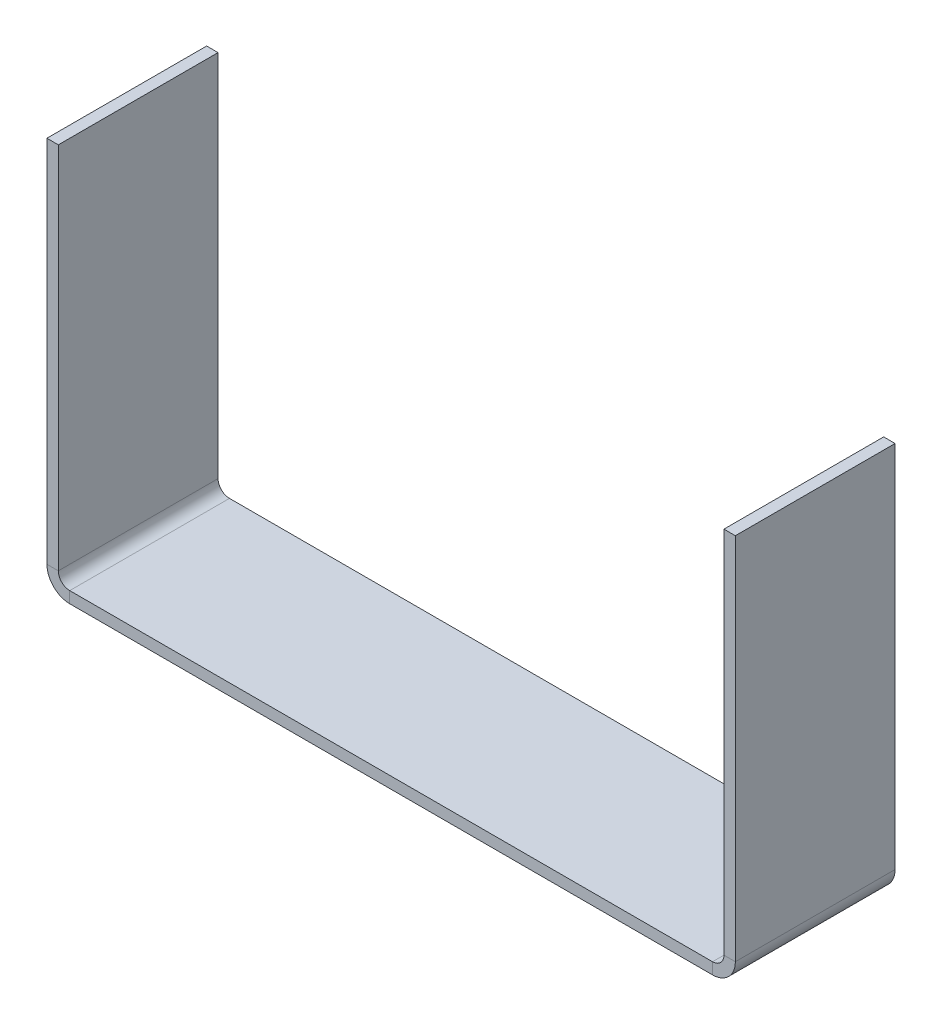
ISO-10303-21;
HEADER;
FILE_DESCRIPTION(('STEP AP214'),'2;1');
FILE_NAME('part.step','',(''),(''),'','','');
FILE_SCHEMA(('AUTOMOTIVE_DESIGN { 1 0 10303 214 1 1 1 1 }'));
ENDSEC;
DATA;
#1=APPLICATION_CONTEXT('core data for automotive mechanical design processes');
#2=APPLICATION_PROTOCOL_DEFINITION('international standard','automotive_design',2000,#1);
#3=PRODUCT_CONTEXT('',#1,'mechanical');
#4=PRODUCT('Part','Part','',(#3));
#5=PRODUCT_RELATED_PRODUCT_CATEGORY('part','',(#4));
#6=PRODUCT_DEFINITION_FORMATION('','',#4);
#7=PRODUCT_DEFINITION_CONTEXT('part definition',#1,'design');
#8=PRODUCT_DEFINITION('design','',#6,#7);
#9=PRODUCT_DEFINITION_SHAPE('','',#8);
#10=(LENGTH_UNIT() NAMED_UNIT(*) SI_UNIT(.MILLI.,.METRE.));
#11=(NAMED_UNIT(*) PLANE_ANGLE_UNIT() SI_UNIT($,.RADIAN.));
#12=(NAMED_UNIT(*) SI_UNIT($,.STERADIAN.) SOLID_ANGLE_UNIT());
#13=UNCERTAINTY_MEASURE_WITH_UNIT(LENGTH_MEASURE(1.E-05),#10,'distance_accuracy_value','');
#14=(GEOMETRIC_REPRESENTATION_CONTEXT(3) GLOBAL_UNCERTAINTY_ASSIGNED_CONTEXT((#13)) GLOBAL_UNIT_ASSIGNED_CONTEXT((#10,
#11,#12)) REPRESENTATION_CONTEXT('',''));
#15=CARTESIAN_POINT('',(0.,0.,0.));
#16=DIRECTION('',(0.,0.,1.));
#17=DIRECTION('',(1.,0.,0.));
#18=AXIS2_PLACEMENT_3D('',#15,#16,#17);
#19=CARTESIAN_POINT('',(-84.5,0.,21.));
#20=DIRECTION('',(0.,0.,1.));
#21=DIRECTION('',(1.,0.,0.));
#22=AXIS2_PLACEMENT_3D('',#19,#20,#21);
#23=PLANE('',#22);
#24=DIRECTION('',(0.,-1.,0.));
#25=VECTOR('',#24,1.);
#26=CARTESIAN_POINT('',(-84.5,0.,21.));
#27=LINE('',#26,#25);
#28=CARTESIAN_POINT('',(-84.5,0.,21.));
#29=VERTEX_POINT('',#28);
#30=CARTESIAN_POINT('',(-84.5,-3.,21.));
#31=VERTEX_POINT('',#30);
#32=EDGE_CURVE('E11',#29,#31,#27,.T.);
#33=ORIENTED_EDGE('',*,*,#32,.F.);
#34=CARTESIAN_POINT('',(-84.5,3.,21.));
#35=DIRECTION('',(0.,0.,-1.));
#36=DIRECTION('',(-1.,0.,0.));
#37=AXIS2_PLACEMENT_3D('',#34,#35,#36);
#38=CIRCLE('',#37,3.);
#39=CARTESIAN_POINT('',(-87.5,3.,21.));
#40=VERTEX_POINT('',#39);
#41=EDGE_CURVE('E247',#40,#29,#38,.F.);
#42=ORIENTED_EDGE('',*,*,#41,.F.);
#43=DIRECTION('',(1.,0.,0.));
#44=VECTOR('',#43,1.);
#45=CARTESIAN_POINT('',(-90.5,3.,21.));
#46=LINE('',#45,#44);
#47=CARTESIAN_POINT('',(-90.5,3.,21.));
#48=VERTEX_POINT('',#47);
#49=EDGE_CURVE('E45',#48,#40,#46,.T.);
#50=ORIENTED_EDGE('',*,*,#49,.F.);
#51=CARTESIAN_POINT('',(-84.5,3.,21.));
#52=DIRECTION('',(0.,0.,1.));
#53=DIRECTION('',(1.,0.,0.));
#54=AXIS2_PLACEMENT_3D('',#51,#52,#53);
#55=CIRCLE('',#54,6.);
#56=EDGE_CURVE('E146',#48,#31,#55,.T.);
#57=ORIENTED_EDGE('',*,*,#56,.T.);
#58=EDGE_LOOP('',(#33,#42,#50,#57));
#59=FACE_BOUND('',#58,.T.);
#60=ADVANCED_FACE('F37',(#59),#23,.T.);
#61=CARTESIAN_POINT('',(-90.5,3.,21.));
#62=DIRECTION('',(0.,0.,1.));
#63=DIRECTION('',(1.,0.,0.));
#64=AXIS2_PLACEMENT_3D('',#61,#62,#63);
#65=PLANE('',#64);
#66=DIRECTION('',(1.,0.,0.));
#67=VECTOR('',#66,1.);
#68=CARTESIAN_POINT('',(-87.5,0.,21.));
#69=LINE('',#68,#67);
#70=CARTESIAN_POINT('',(84.5,0.,21.));
#71=VERTEX_POINT('',#70);
#72=EDGE_CURVE('E140',#29,#71,#69,.T.);
#73=ORIENTED_EDGE('',*,*,#72,.F.);
#74=ORIENTED_EDGE('',*,*,#32,.T.);
#75=DIRECTION('',(1.,0.,0.));
#76=VECTOR('',#75,1.);
#77=CARTESIAN_POINT('',(-87.5,-3.,21.));
#78=LINE('',#77,#76);
#79=CARTESIAN_POINT('',(84.5,-2.99999999999997,21.));
#80=VERTEX_POINT('',#79);
#81=EDGE_CURVE('E137',#31,#80,#78,.T.);
#82=ORIENTED_EDGE('',*,*,#81,.T.);
#83=DIRECTION('',(0.,1.,0.));
#84=VECTOR('',#83,1.);
#85=CARTESIAN_POINT('',(84.5,-2.99999999999997,21.));
#86=LINE('',#85,#84);
#87=EDGE_CURVE('E228',#80,#71,#86,.T.);
#88=ORIENTED_EDGE('',*,*,#87,.T.);
#89=EDGE_LOOP('',(#73,#74,#82,#88));
#90=FACE_BOUND('',#89,.T.);
#91=ADVANCED_FACE('F135',(#90),#65,.T.);
#92=CARTESIAN_POINT('',(-87.5,3.,-21.));
#93=DIRECTION('',(0.,0.,-1.));
#94=DIRECTION('',(-1.,0.,0.));
#95=AXIS2_PLACEMENT_3D('',#92,#93,#94);
#96=PLANE('',#95);
#97=DIRECTION('',(-1.,0.,0.));
#98=VECTOR('',#97,1.);
#99=CARTESIAN_POINT('',(-87.5,3.,-21.));
#100=LINE('',#99,#98);
#101=CARTESIAN_POINT('',(-87.5,3.,-21.));
#102=VERTEX_POINT('',#101);
#103=CARTESIAN_POINT('',(-90.5,3.,-21.));
#104=VERTEX_POINT('',#103);
#105=EDGE_CURVE('E233',#102,#104,#100,.T.);
#106=ORIENTED_EDGE('',*,*,#105,.F.);
#107=CARTESIAN_POINT('',(-84.5,3.,-21.));
#108=DIRECTION('',(0.,0.,-1.));
#109=DIRECTION('',(-1.,0.,0.));
#110=AXIS2_PLACEMENT_3D('',#107,#108,#109);
#111=CIRCLE('',#110,3.);
#112=CARTESIAN_POINT('',(-84.5,0.,-21.));
#113=VERTEX_POINT('',#112);
#114=EDGE_CURVE('E185',#102,#113,#111,.F.);
#115=ORIENTED_EDGE('',*,*,#114,.T.);
#116=DIRECTION('',(0.,1.,0.));
#117=VECTOR('',#116,1.);
#118=CARTESIAN_POINT('',(-84.5,-3.,-21.));
#119=LINE('',#118,#117);
#120=CARTESIAN_POINT('',(-84.5,-3.,-21.));
#121=VERTEX_POINT('',#120);
#122=EDGE_CURVE('E231',#121,#113,#119,.T.);
#123=ORIENTED_EDGE('',*,*,#122,.F.);
#124=CARTESIAN_POINT('',(-84.5,3.,-21.));
#125=DIRECTION('',(0.,0.,1.));
#126=DIRECTION('',(1.,0.,0.));
#127=AXIS2_PLACEMENT_3D('',#124,#125,#126);
#128=CIRCLE('',#127,6.);
#129=EDGE_CURVE('E158',#104,#121,#128,.T.);
#130=ORIENTED_EDGE('',*,*,#129,.F.);
#131=EDGE_LOOP('',(#106,#115,#123,#130));
#132=FACE_BOUND('',#131,.T.);
#133=ADVANCED_FACE('F285',(#132),#96,.T.);
#134=CARTESIAN_POINT('',(-84.5,-3.,-21.));
#135=DIRECTION('',(0.,0.,-1.));
#136=DIRECTION('',(-1.,0.,0.));
#137=AXIS2_PLACEMENT_3D('',#134,#135,#136);
#138=PLANE('',#137);
#139=DIRECTION('',(0.,-1.,0.));
#140=VECTOR('',#139,1.);
#141=CARTESIAN_POINT('',(-87.5,0.,-21.));
#142=LINE('',#141,#140);
#143=CARTESIAN_POINT('',(-87.5,100.,-21.));
#144=VERTEX_POINT('',#143);
#145=EDGE_CURVE('E188',#144,#102,#142,.T.);
#146=ORIENTED_EDGE('',*,*,#145,.T.);
#147=ORIENTED_EDGE('',*,*,#105,.T.);
#148=DIRECTION('',(0.,1.,0.));
#149=VECTOR('',#148,1.);
#150=CARTESIAN_POINT('',(-90.5,0.,-21.));
#151=LINE('',#150,#149);
#152=CARTESIAN_POINT('',(-90.5,100.,-21.));
#153=VERTEX_POINT('',#152);
#154=EDGE_CURVE('E194',#153,#104,#151,.F.);
#155=ORIENTED_EDGE('',*,*,#154,.F.);
#156=DIRECTION('',(1.,0.,0.));
#157=VECTOR('',#156,1.);
#158=CARTESIAN_POINT('',(-90.5,100.,-21.));
#159=LINE('',#158,#157);
#160=EDGE_CURVE('E191',#153,#144,#159,.T.);
#161=ORIENTED_EDGE('',*,*,#160,.T.);
#162=EDGE_LOOP('',(#146,#147,#155,#161));
#163=FACE_BOUND('',#162,.T.);
#164=ADVANCED_FACE('F288',(#163),#138,.T.);
#165=CARTESIAN_POINT('',(87.5,3.00000000000003,21.));
#166=DIRECTION('',(0.,0.,1.));
#167=DIRECTION('',(1.,0.,0.));
#168=AXIS2_PLACEMENT_3D('',#165,#166,#167);
#169=PLANE('',#168);
#170=DIRECTION('',(1.,0.,0.));
#171=VECTOR('',#170,1.);
#172=CARTESIAN_POINT('',(87.5,3.00000000000003,21.));
#173=LINE('',#172,#171);
#174=CARTESIAN_POINT('',(87.5,3.00000000000003,21.));
#175=VERTEX_POINT('',#174);
#176=CARTESIAN_POINT('',(90.5,3.00000000000003,21.));
#177=VERTEX_POINT('',#176);
#178=EDGE_CURVE('E53',#175,#177,#173,.T.);
#179=ORIENTED_EDGE('',*,*,#178,.F.);
#180=CARTESIAN_POINT('',(84.5,3.00000000000003,21.));
#181=DIRECTION('',(0.,0.,-1.));
#182=DIRECTION('',(-1.,0.,0.));
#183=AXIS2_PLACEMENT_3D('',#180,#181,#182);
#184=CIRCLE('',#183,3.);
#185=EDGE_CURVE('E257',#71,#175,#184,.F.);
#186=ORIENTED_EDGE('',*,*,#185,.F.);
#187=ORIENTED_EDGE('',*,*,#87,.F.);
#188=CARTESIAN_POINT('',(84.5,3.00000000000003,21.));
#189=DIRECTION('',(0.,0.,1.));
#190=DIRECTION('',(1.,0.,0.));
#191=AXIS2_PLACEMENT_3D('',#188,#189,#190);
#192=CIRCLE('',#191,6.);
#193=EDGE_CURVE('E166',#80,#177,#192,.T.);
#194=ORIENTED_EDGE('',*,*,#193,.T.);
#195=EDGE_LOOP('',(#179,#186,#187,#194));
#196=FACE_BOUND('',#195,.T.);
#197=ADVANCED_FACE('F280',(#196),#169,.T.);
#198=CARTESIAN_POINT('',(84.5,-2.99999999999997,21.));
#199=DIRECTION('',(0.,0.,1.));
#200=DIRECTION('',(1.,0.,0.));
#201=AXIS2_PLACEMENT_3D('',#198,#199,#200);
#202=PLANE('',#201);
#203=DIRECTION('',(0.,1.,0.));
#204=VECTOR('',#203,1.);
#205=CARTESIAN_POINT('',(87.5,0.,21.));
#206=LINE('',#205,#204);
#207=CARTESIAN_POINT('',(87.5,100.,21.));
#208=VERTEX_POINT('',#207);
#209=EDGE_CURVE('E260',#175,#208,#206,.T.);
#210=ORIENTED_EDGE('',*,*,#209,.F.);
#211=ORIENTED_EDGE('',*,*,#178,.T.);
#212=DIRECTION('',(0.,1.,0.));
#213=VECTOR('',#212,1.);
#214=CARTESIAN_POINT('',(90.5,0.,21.));
#215=LINE('',#214,#213);
#216=CARTESIAN_POINT('',(90.5,100.,21.));
#217=VERTEX_POINT('',#216);
#218=EDGE_CURVE('E107',#177,#217,#215,.T.);
#219=ORIENTED_EDGE('',*,*,#218,.T.);
#220=DIRECTION('',(1.,0.,0.));
#221=VECTOR('',#220,1.);
#222=CARTESIAN_POINT('',(87.5,100.,21.));
#223=LINE('',#222,#221);
#224=EDGE_CURVE('E263',#208,#217,#223,.T.);
#225=ORIENTED_EDGE('',*,*,#224,.F.);
#226=EDGE_LOOP('',(#210,#211,#219,#225));
#227=FACE_BOUND('',#226,.T.);
#228=ADVANCED_FACE('F269',(#227),#202,.T.);
#229=CARTESIAN_POINT('',(84.5,0.,-21.));
#230=DIRECTION('',(0.,0.,-1.));
#231=DIRECTION('',(-1.,0.,0.));
#232=AXIS2_PLACEMENT_3D('',#229,#230,#231);
#233=PLANE('',#232);
#234=DIRECTION('',(0.,-1.,0.));
#235=VECTOR('',#234,1.);
#236=CARTESIAN_POINT('',(84.5,0.,-21.));
#237=LINE('',#236,#235);
#238=CARTESIAN_POINT('',(84.5,0.,-21.));
#239=VERTEX_POINT('',#238);
#240=CARTESIAN_POINT('',(84.5,-2.99999999999997,-21.));
#241=VERTEX_POINT('',#240);
#242=EDGE_CURVE('E94',#239,#241,#237,.T.);
#243=ORIENTED_EDGE('',*,*,#242,.F.);
#244=CARTESIAN_POINT('',(84.5,3.00000000000003,-21.));
#245=DIRECTION('',(0.,0.,-1.));
#246=DIRECTION('',(-1.,0.,0.));
#247=AXIS2_PLACEMENT_3D('',#244,#245,#246);
#248=CIRCLE('',#247,3.);
#249=CARTESIAN_POINT('',(87.5,3.00000000000003,-21.));
#250=VERTEX_POINT('',#249);
#251=EDGE_CURVE('E181',#239,#250,#248,.F.);
#252=ORIENTED_EDGE('',*,*,#251,.T.);
#253=DIRECTION('',(-1.,0.,0.));
#254=VECTOR('',#253,1.);
#255=CARTESIAN_POINT('',(90.5,3.00000000000003,-21.));
#256=LINE('',#255,#254);
#257=CARTESIAN_POINT('',(90.5,3.00000000000003,-21.));
#258=VERTEX_POINT('',#257);
#259=EDGE_CURVE('E101',#258,#250,#256,.T.);
#260=ORIENTED_EDGE('',*,*,#259,.F.);
#261=CARTESIAN_POINT('',(84.5,3.00000000000003,-21.));
#262=DIRECTION('',(0.,0.,1.));
#263=DIRECTION('',(1.,0.,0.));
#264=AXIS2_PLACEMENT_3D('',#261,#262,#263);
#265=CIRCLE('',#264,6.);
#266=EDGE_CURVE('E200',#241,#258,#265,.T.);
#267=ORIENTED_EDGE('',*,*,#266,.F.);
#268=EDGE_LOOP('',(#243,#252,#260,#267));
#269=FACE_BOUND('',#268,.T.);
#270=ADVANCED_FACE('F317',(#269),#233,.T.);
#271=CARTESIAN_POINT('',(90.5,3.00000000000003,-21.));
#272=DIRECTION('',(0.,0.,-1.));
#273=DIRECTION('',(-1.,0.,0.));
#274=AXIS2_PLACEMENT_3D('',#271,#272,#273);
#275=PLANE('',#274);
#276=DIRECTION('',(1.,0.,0.));
#277=VECTOR('',#276,1.);
#278=CARTESIAN_POINT('',(-87.5,0.,-21.));
#279=LINE('',#278,#277);
#280=EDGE_CURVE('E183',#113,#239,#279,.T.);
#281=ORIENTED_EDGE('',*,*,#280,.T.);
#282=ORIENTED_EDGE('',*,*,#242,.T.);
#283=DIRECTION('',(1.,0.,0.));
#284=VECTOR('',#283,1.);
#285=CARTESIAN_POINT('',(-87.5,-3.,-21.));
#286=LINE('',#285,#284);
#287=EDGE_CURVE('E198',#121,#241,#286,.T.);
#288=ORIENTED_EDGE('',*,*,#287,.F.);
#289=ORIENTED_EDGE('',*,*,#122,.T.);
#290=EDGE_LOOP('',(#281,#282,#288,#289));
#291=FACE_BOUND('',#290,.T.);
#292=ADVANCED_FACE('F320',(#291),#275,.T.);
#293=CARTESIAN_POINT('',(90.5,0.,21.));
#294=DIRECTION('',(-1.,0.,0.));
#295=DIRECTION('',(0.,-1.,0.));
#296=AXIS2_PLACEMENT_3D('',#293,#294,#295);
#297=PLANE('',#296);
#298=DIRECTION('',(0.,1.,0.));
#299=VECTOR('',#298,1.);
#300=CARTESIAN_POINT('',(90.5,0.,-21.));
#301=LINE('',#300,#299);
#302=CARTESIAN_POINT('',(90.5,100.,-21.));
#303=VERTEX_POINT('',#302);
#304=EDGE_CURVE('E172',#258,#303,#301,.T.);
#305=ORIENTED_EDGE('',*,*,#304,.T.);
#306=DIRECTION('',(0.,0.,-1.));
#307=VECTOR('',#306,1.);
#308=CARTESIAN_POINT('',(90.5,100.,21.));
#309=LINE('',#308,#307);
#310=EDGE_CURVE('E224',#217,#303,#309,.T.);
#311=ORIENTED_EDGE('',*,*,#310,.F.);
#312=ORIENTED_EDGE('',*,*,#218,.F.);
#313=DIRECTION('',(0.,0.,-1.));
#314=VECTOR('',#313,1.);
#315=CARTESIAN_POINT('',(90.5,3.00000000000003,21.));
#316=LINE('',#315,#314);
#317=EDGE_CURVE('E168',#177,#258,#316,.T.);
#318=ORIENTED_EDGE('',*,*,#317,.T.);
#319=EDGE_LOOP('',(#305,#311,#312,#318));
#320=FACE_BOUND('',#319,.T.);
#321=ADVANCED_FACE('F323',(#320),#297,.F.);
#322=CARTESIAN_POINT('',(87.5,100.,21.));
#323=DIRECTION('',(0.,1.,0.));
#324=DIRECTION('',(0.,0.,1.));
#325=AXIS2_PLACEMENT_3D('',#322,#323,#324);
#326=PLANE('',#325);
#327=DIRECTION('',(1.,0.,0.));
#328=VECTOR('',#327,1.);
#329=CARTESIAN_POINT('',(87.5,100.,-21.));
#330=LINE('',#329,#328);
#331=CARTESIAN_POINT('',(87.5,100.,-21.));
#332=VERTEX_POINT('',#331);
#333=EDGE_CURVE('E175',#332,#303,#330,.T.);
#334=ORIENTED_EDGE('',*,*,#333,.F.);
#335=DIRECTION('',(0.,0.,-1.));
#336=VECTOR('',#335,1.);
#337=CARTESIAN_POINT('',(87.5,100.,21.));
#338=LINE('',#337,#336);
#339=EDGE_CURVE('E222',#208,#332,#338,.T.);
#340=ORIENTED_EDGE('',*,*,#339,.F.);
#341=ORIENTED_EDGE('',*,*,#224,.T.);
#342=ORIENTED_EDGE('',*,*,#310,.T.);
#343=EDGE_LOOP('',(#334,#340,#341,#342));
#344=FACE_BOUND('',#343,.T.);
#345=ADVANCED_FACE('F268',(#344),#326,.T.);
#346=CARTESIAN_POINT('',(87.5,0.,21.));
#347=DIRECTION('',(-1.,0.,0.));
#348=DIRECTION('',(0.,-1.,0.));
#349=AXIS2_PLACEMENT_3D('',#346,#347,#348);
#350=PLANE('',#349);
#351=DIRECTION('',(0.,1.,0.));
#352=VECTOR('',#351,1.);
#353=CARTESIAN_POINT('',(87.5,0.,-21.));
#354=LINE('',#353,#352);
#355=EDGE_CURVE('E178',#250,#332,#354,.T.);
#356=ORIENTED_EDGE('',*,*,#355,.F.);
#357=DIRECTION('',(0.,0.,-1.));
#358=VECTOR('',#357,1.);
#359=CARTESIAN_POINT('',(87.5,3.00000000000003,21.));
#360=LINE('',#359,#358);
#361=EDGE_CURVE('E219',#175,#250,#360,.T.);
#362=ORIENTED_EDGE('',*,*,#361,.F.);
#363=ORIENTED_EDGE('',*,*,#209,.T.);
#364=ORIENTED_EDGE('',*,*,#339,.T.);
#365=EDGE_LOOP('',(#356,#362,#363,#364));
#366=FACE_BOUND('',#365,.T.);
#367=ADVANCED_FACE('F273',(#366),#350,.T.);
#368=CARTESIAN_POINT('',(84.5,3.00000000000003,21.));
#369=DIRECTION('',(0.,0.,-1.));
#370=DIRECTION('',(-1.,0.,0.));
#371=AXIS2_PLACEMENT_3D('',#368,#369,#370);
#372=CYLINDRICAL_SURFACE('',#371,3.);
#373=ORIENTED_EDGE('',*,*,#251,.F.);
#374=DIRECTION('',(0.,0.,-1.));
#375=VECTOR('',#374,1.);
#376=CARTESIAN_POINT('',(84.5,0.,21.));
#377=LINE('',#376,#375);
#378=EDGE_CURVE('E216',#71,#239,#377,.T.);
#379=ORIENTED_EDGE('',*,*,#378,.F.);
#380=ORIENTED_EDGE('',*,*,#185,.T.);
#381=ORIENTED_EDGE('',*,*,#361,.T.);
#382=EDGE_LOOP('',(#373,#379,#380,#381));
#383=FACE_BOUND('',#382,.T.);
#384=ADVANCED_FACE('F276',(#383),#372,.F.);
#385=CARTESIAN_POINT('',(-87.5,0.,21.));
#386=DIRECTION('',(0.,1.,0.));
#387=DIRECTION('',(-1.,0.,0.));
#388=AXIS2_PLACEMENT_3D('',#385,#386,#387);
#389=PLANE('',#388);
#390=ORIENTED_EDGE('',*,*,#280,.F.);
#391=DIRECTION('',(0.,0.,-1.));
#392=VECTOR('',#391,1.);
#393=CARTESIAN_POINT('',(-84.5,0.,21.));
#394=LINE('',#393,#392);
#395=EDGE_CURVE('E213',#29,#113,#394,.T.);
#396=ORIENTED_EDGE('',*,*,#395,.F.);
#397=ORIENTED_EDGE('',*,*,#72,.T.);
#398=ORIENTED_EDGE('',*,*,#378,.T.);
#399=EDGE_LOOP('',(#390,#396,#397,#398));
#400=FACE_BOUND('',#399,.T.);
#401=ADVANCED_FACE('F283',(#400),#389,.T.);
#402=CARTESIAN_POINT('',(-84.5,3.,21.));
#403=DIRECTION('',(0.,0.,-1.));
#404=DIRECTION('',(-1.,0.,0.));
#405=AXIS2_PLACEMENT_3D('',#402,#403,#404);
#406=CYLINDRICAL_SURFACE('',#405,3.);
#407=ORIENTED_EDGE('',*,*,#114,.F.);
#408=DIRECTION('',(0.,0.,-1.));
#409=VECTOR('',#408,1.);
#410=CARTESIAN_POINT('',(-87.5,3.,21.));
#411=LINE('',#410,#409);
#412=EDGE_CURVE('E210',#40,#102,#411,.T.);
#413=ORIENTED_EDGE('',*,*,#412,.F.);
#414=ORIENTED_EDGE('',*,*,#41,.T.);
#415=ORIENTED_EDGE('',*,*,#395,.T.);
#416=EDGE_LOOP('',(#407,#413,#414,#415));
#417=FACE_BOUND('',#416,.T.);
#418=ADVANCED_FACE('F246',(#417),#406,.F.);
#419=CARTESIAN_POINT('',(-87.5,0.,21.));
#420=DIRECTION('',(1.,0.,0.));
#421=DIRECTION('',(0.,0.,-1.));
#422=AXIS2_PLACEMENT_3D('',#419,#420,#421);
#423=PLANE('',#422);
#424=ORIENTED_EDGE('',*,*,#145,.F.);
#425=DIRECTION('',(0.,0.,-1.));
#426=VECTOR('',#425,1.);
#427=CARTESIAN_POINT('',(-87.5,100.,21.));
#428=LINE('',#427,#426);
#429=CARTESIAN_POINT('',(-87.5,100.,21.));
#430=VERTEX_POINT('',#429);
#431=EDGE_CURVE('E208',#430,#144,#428,.T.);
#432=ORIENTED_EDGE('',*,*,#431,.F.);
#433=DIRECTION('',(0.,-1.,0.));
#434=VECTOR('',#433,1.);
#435=CARTESIAN_POINT('',(-87.5,0.,21.));
#436=LINE('',#435,#434);
#437=EDGE_CURVE('E240',#430,#40,#436,.T.);
#438=ORIENTED_EDGE('',*,*,#437,.T.);
#439=ORIENTED_EDGE('',*,*,#412,.T.);
#440=EDGE_LOOP('',(#424,#432,#438,#439));
#441=FACE_BOUND('',#440,.T.);
#442=ADVANCED_FACE('F251',(#441),#423,.T.);
#443=CARTESIAN_POINT('',(-90.5,100.,21.));
#444=DIRECTION('',(0.,1.,0.));
#445=DIRECTION('',(0.,0.,1.));
#446=AXIS2_PLACEMENT_3D('',#443,#444,#445);
#447=PLANE('',#446);
#448=ORIENTED_EDGE('',*,*,#160,.F.);
#449=DIRECTION('',(0.,0.,-1.));
#450=VECTOR('',#449,1.);
#451=CARTESIAN_POINT('',(-90.5,100.,21.));
#452=LINE('',#451,#450);
#453=CARTESIAN_POINT('',(-90.5,100.,21.));
#454=VERTEX_POINT('',#453);
#455=EDGE_CURVE('E206',#454,#153,#452,.T.);
#456=ORIENTED_EDGE('',*,*,#455,.F.);
#457=DIRECTION('',(1.,0.,0.));
#458=VECTOR('',#457,1.);
#459=CARTESIAN_POINT('',(-90.5,100.,21.));
#460=LINE('',#459,#458);
#461=EDGE_CURVE('E252',#454,#430,#460,.T.);
#462=ORIENTED_EDGE('',*,*,#461,.T.);
#463=ORIENTED_EDGE('',*,*,#431,.T.);
#464=EDGE_LOOP('',(#448,#456,#462,#463));
#465=FACE_BOUND('',#464,.T.);
#466=ADVANCED_FACE('F293',(#465),#447,.T.);
#467=CARTESIAN_POINT('',(-90.5,0.,21.));
#468=DIRECTION('',(1.,0.,0.));
#469=DIRECTION('',(0.,0.,-1.));
#470=AXIS2_PLACEMENT_3D('',#467,#468,#469);
#471=PLANE('',#470);
#472=ORIENTED_EDGE('',*,*,#154,.T.);
#473=DIRECTION('',(0.,0.,-1.));
#474=VECTOR('',#473,1.);
#475=CARTESIAN_POINT('',(-90.5,3.,21.));
#476=LINE('',#475,#474);
#477=EDGE_CURVE('E160',#48,#104,#476,.T.);
#478=ORIENTED_EDGE('',*,*,#477,.F.);
#479=DIRECTION('',(0.,1.,0.));
#480=VECTOR('',#479,1.);
#481=CARTESIAN_POINT('',(-90.5,0.,21.));
#482=LINE('',#481,#480);
#483=EDGE_CURVE('E151',#454,#48,#482,.F.);
#484=ORIENTED_EDGE('',*,*,#483,.F.);
#485=ORIENTED_EDGE('',*,*,#455,.T.);
#486=EDGE_LOOP('',(#472,#478,#484,#485));
#487=FACE_BOUND('',#486,.T.);
#488=ADVANCED_FACE('F291',(#487),#471,.F.);
#489=CARTESIAN_POINT('',(-84.5,3.,21.));
#490=DIRECTION('',(0.,0.,-1.));
#491=DIRECTION('',(-1.,0.,0.));
#492=AXIS2_PLACEMENT_3D('',#489,#490,#491);
#493=CYLINDRICAL_SURFACE('',#492,6.);
#494=ORIENTED_EDGE('',*,*,#129,.T.);
#495=DIRECTION('',(0.,0.,-1.));
#496=VECTOR('',#495,1.);
#497=CARTESIAN_POINT('',(-84.5,-3.,21.));
#498=LINE('',#497,#496);
#499=EDGE_CURVE('E155',#31,#121,#498,.T.);
#500=ORIENTED_EDGE('',*,*,#499,.F.);
#501=ORIENTED_EDGE('',*,*,#56,.F.);
#502=ORIENTED_EDGE('',*,*,#477,.T.);
#503=EDGE_LOOP('',(#494,#500,#501,#502));
#504=FACE_BOUND('',#503,.T.);
#505=ADVANCED_FACE('F156',(#504),#493,.T.);
#506=CARTESIAN_POINT('',(-87.5,-3.,21.));
#507=DIRECTION('',(0.,1.,0.));
#508=DIRECTION('',(-1.,0.,0.));
#509=AXIS2_PLACEMENT_3D('',#506,#507,#508);
#510=PLANE('',#509);
#511=ORIENTED_EDGE('',*,*,#287,.T.);
#512=DIRECTION('',(0.,0.,-1.));
#513=VECTOR('',#512,1.);
#514=CARTESIAN_POINT('',(84.5,-2.99999999999997,21.));
#515=LINE('',#514,#513);
#516=EDGE_CURVE('E161',#80,#241,#515,.T.);
#517=ORIENTED_EDGE('',*,*,#516,.F.);
#518=ORIENTED_EDGE('',*,*,#81,.F.);
#519=ORIENTED_EDGE('',*,*,#499,.T.);
#520=EDGE_LOOP('',(#511,#517,#518,#519));
#521=FACE_BOUND('',#520,.T.);
#522=ADVANCED_FACE('F163',(#521),#510,.F.);
#523=CARTESIAN_POINT('',(84.5,3.00000000000003,21.));
#524=DIRECTION('',(0.,0.,-1.));
#525=DIRECTION('',(-1.,0.,0.));
#526=AXIS2_PLACEMENT_3D('',#523,#524,#525);
#527=CYLINDRICAL_SURFACE('',#526,6.);
#528=ORIENTED_EDGE('',*,*,#266,.T.);
#529=ORIENTED_EDGE('',*,*,#317,.F.);
#530=ORIENTED_EDGE('',*,*,#193,.F.);
#531=ORIENTED_EDGE('',*,*,#516,.T.);
#532=EDGE_LOOP('',(#528,#529,#530,#531));
#533=FACE_BOUND('',#532,.T.);
#534=ADVANCED_FACE('F375',(#533),#527,.T.);
#535=CARTESIAN_POINT('',(84.5,3.00000000000003,21.));
#536=DIRECTION('',(0.,0.,-1.));
#537=DIRECTION('',(-1.,0.,0.));
#538=AXIS2_PLACEMENT_3D('',#535,#536,#537);
#539=PLANE('',#538);
#540=ORIENTED_EDGE('',*,*,#483,.T.);
#541=ORIENTED_EDGE('',*,*,#49,.T.);
#542=ORIENTED_EDGE('',*,*,#437,.F.);
#543=ORIENTED_EDGE('',*,*,#461,.F.);
#544=EDGE_LOOP('',(#540,#541,#542,#543));
#545=FACE_BOUND('',#544,.T.);
#546=ADVANCED_FACE('F237',(#545),#539,.F.);
#547=CARTESIAN_POINT('',(84.5,3.00000000000003,-21.));
#548=DIRECTION('',(0.,0.,-1.));
#549=DIRECTION('',(-1.,0.,0.));
#550=AXIS2_PLACEMENT_3D('',#547,#548,#549);
#551=PLANE('',#550);
#552=ORIENTED_EDGE('',*,*,#304,.F.);
#553=ORIENTED_EDGE('',*,*,#259,.T.);
#554=ORIENTED_EDGE('',*,*,#355,.T.);
#555=ORIENTED_EDGE('',*,*,#333,.T.);
#556=EDGE_LOOP('',(#552,#553,#554,#555));
#557=FACE_BOUND('',#556,.T.);
#558=ADVANCED_FACE('F395',(#557),#551,.T.);
#559=CLOSED_SHELL('',(#60,#91,#133,#164,#197,#228,#270,#292,#321,#345,#367,#384,#401,#418,#442,
#466,#488,#505,#522,#534,#546,#558));
#560=MANIFOLD_SOLID_BREP('B2',#559);
#561=ADVANCED_BREP_SHAPE_REPRESENTATION('',(#18,#560),#14);
#562=SHAPE_DEFINITION_REPRESENTATION(#9,#561);
ENDSEC;
END-ISO-10303-21;
